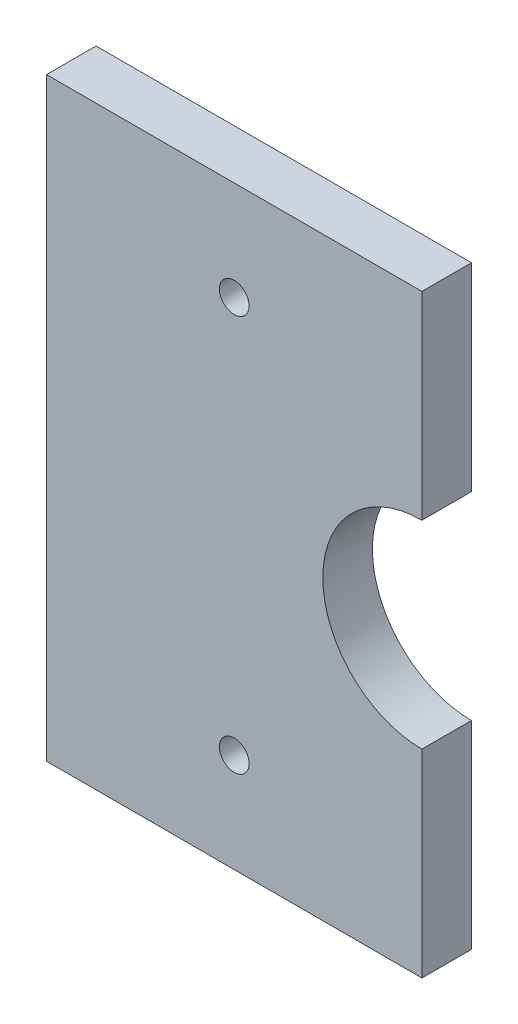
ISO-10303-21;
HEADER;
FILE_DESCRIPTION(('STEP AP214'),'2;1');
FILE_NAME('part.step','',(''),(''),'','','');
FILE_SCHEMA(('AUTOMOTIVE_DESIGN { 1 0 10303 214 1 1 1 1 }'));
ENDSEC;
DATA;
#1=APPLICATION_CONTEXT('core data for automotive mechanical design processes');
#2=APPLICATION_PROTOCOL_DEFINITION('international standard','automotive_design',2000,#1);
#3=PRODUCT_CONTEXT('',#1,'mechanical');
#4=PRODUCT('Part','Part','',(#3));
#5=PRODUCT_RELATED_PRODUCT_CATEGORY('part','',(#4));
#6=PRODUCT_DEFINITION_FORMATION('','',#4);
#7=PRODUCT_DEFINITION_CONTEXT('part definition',#1,'design');
#8=PRODUCT_DEFINITION('design','',#6,#7);
#9=PRODUCT_DEFINITION_SHAPE('','',#8);
#10=(LENGTH_UNIT() NAMED_UNIT(*) SI_UNIT(.MILLI.,.METRE.));
#11=(NAMED_UNIT(*) PLANE_ANGLE_UNIT() SI_UNIT($,.RADIAN.));
#12=(NAMED_UNIT(*) SI_UNIT($,.STERADIAN.) SOLID_ANGLE_UNIT());
#13=UNCERTAINTY_MEASURE_WITH_UNIT(LENGTH_MEASURE(1.E-05),#10,'distance_accuracy_value','');
#14=(GEOMETRIC_REPRESENTATION_CONTEXT(3) GLOBAL_UNCERTAINTY_ASSIGNED_CONTEXT((#13)) GLOBAL_UNIT_ASSIGNED_CONTEXT((#10,
#11,#12)) REPRESENTATION_CONTEXT('',''));
#15=CARTESIAN_POINT('',(0.,0.,0.));
#16=DIRECTION('',(0.,0.,1.));
#17=DIRECTION('',(1.,0.,0.));
#18=AXIS2_PLACEMENT_3D('',#15,#16,#17);
#19=CARTESIAN_POINT('',(0.,0.,10.));
#20=DIRECTION('',(1.,0.,0.));
#21=DIRECTION('',(0.,0.,-1.));
#22=AXIS2_PLACEMENT_3D('',#19,#20,#21);
#23=PLANE('',#22);
#24=DIRECTION('',(0.,0.,1.));
#25=VECTOR('',#24,1.);
#26=CARTESIAN_POINT('',(0.,20.,-10.));
#27=LINE('',#26,#25);
#28=CARTESIAN_POINT('',(0.,20.,0.));
#29=VERTEX_POINT('',#28);
#30=CARTESIAN_POINT('',(0.,20.,10.));
#31=VERTEX_POINT('',#30);
#32=EDGE_CURVE('E100',#29,#31,#27,.T.);
#33=ORIENTED_EDGE('',*,*,#32,.F.);
#34=DIRECTION('',(0.,-1.,0.));
#35=VECTOR('',#34,1.);
#36=CARTESIAN_POINT('',(0.,0.,0.));
#37=LINE('',#36,#35);
#38=CARTESIAN_POINT('',(0.,60.,0.));
#39=VERTEX_POINT('',#38);
#40=EDGE_CURVE('E130',#39,#29,#37,.T.);
#41=ORIENTED_EDGE('',*,*,#40,.F.);
#42=DIRECTION('',(0.,0.,-1.));
#43=VECTOR('',#42,1.);
#44=CARTESIAN_POINT('',(0.,60.,10.));
#45=LINE('',#44,#43);
#46=CARTESIAN_POINT('',(0.,60.,10.));
#47=VERTEX_POINT('',#46);
#48=EDGE_CURVE('E49',#47,#39,#45,.T.);
#49=ORIENTED_EDGE('',*,*,#48,.F.);
#50=DIRECTION('',(0.,-1.,0.));
#51=VECTOR('',#50,1.);
#52=CARTESIAN_POINT('',(0.,0.,10.));
#53=LINE('',#52,#51);
#54=EDGE_CURVE('E110',#47,#31,#53,.T.);
#55=ORIENTED_EDGE('',*,*,#54,.T.);
#56=EDGE_LOOP('',(#33,#41,#49,#55));
#57=FACE_BOUND('',#56,.T.);
#58=ADVANCED_FACE('F41',(#57),#23,.T.);
#59=DIRECTION('',(0.,0.,1.));
#60=VECTOR('',#59,1.);
#61=CARTESIAN_POINT('',(0.,-20.,-10.));
#62=LINE('',#61,#60);
#63=CARTESIAN_POINT('',(0.,-20.,10.));
#64=VERTEX_POINT('',#63);
#65=CARTESIAN_POINT('',(0.,-20.,0.));
#66=VERTEX_POINT('',#65);
#67=EDGE_CURVE('E56',#64,#66,#62,.F.);
#68=ORIENTED_EDGE('',*,*,#67,.F.);
#69=CARTESIAN_POINT('',(0.,-60.,10.));
#70=VERTEX_POINT('',#69);
#71=EDGE_CURVE('E63',#64,#70,#53,.T.);
#72=ORIENTED_EDGE('',*,*,#71,.T.);
#73=DIRECTION('',(0.,0.,-1.));
#74=VECTOR('',#73,1.);
#75=CARTESIAN_POINT('',(0.,-60.,10.));
#76=LINE('',#75,#74);
#77=CARTESIAN_POINT('',(0.,-60.,0.));
#78=VERTEX_POINT('',#77);
#79=EDGE_CURVE('E129',#70,#78,#76,.T.);
#80=ORIENTED_EDGE('',*,*,#79,.T.);
#81=EDGE_CURVE('E85',#66,#78,#37,.T.);
#82=ORIENTED_EDGE('',*,*,#81,.F.);
#83=EDGE_LOOP('',(#68,#72,#80,#82));
#84=FACE_BOUND('',#83,.T.);
#85=ADVANCED_FACE('F43',(#84),#23,.T.);
#86=CARTESIAN_POINT('',(0.,60.,10.));
#87=DIRECTION('',(0.,1.,0.));
#88=DIRECTION('',(0.,0.,1.));
#89=AXIS2_PLACEMENT_3D('',#86,#87,#88);
#90=PLANE('',#89);
#91=DIRECTION('',(1.,0.,0.));
#92=VECTOR('',#91,1.);
#93=CARTESIAN_POINT('',(0.,60.,0.));
#94=LINE('',#93,#92);
#95=CARTESIAN_POINT('',(-75.7608317064828,60.,0.));
#96=VERTEX_POINT('',#95);
#97=EDGE_CURVE('E132',#96,#39,#94,.T.);
#98=ORIENTED_EDGE('',*,*,#97,.F.);
#99=DIRECTION('',(0.,0.,-1.));
#100=VECTOR('',#99,1.);
#101=CARTESIAN_POINT('',(-75.7608317064828,60.,10.));
#102=LINE('',#101,#100);
#103=CARTESIAN_POINT('',(-75.7608317064828,60.,10.));
#104=VERTEX_POINT('',#103);
#105=EDGE_CURVE('E149',#104,#96,#102,.T.);
#106=ORIENTED_EDGE('',*,*,#105,.F.);
#107=DIRECTION('',(1.,0.,0.));
#108=VECTOR('',#107,1.);
#109=CARTESIAN_POINT('',(0.,60.,10.));
#110=LINE('',#109,#108);
#111=EDGE_CURVE('E113',#104,#47,#110,.T.);
#112=ORIENTED_EDGE('',*,*,#111,.T.);
#113=ORIENTED_EDGE('',*,*,#48,.T.);
#114=EDGE_LOOP('',(#98,#106,#112,#113));
#115=FACE_BOUND('',#114,.T.);
#116=ADVANCED_FACE('F152',(#115),#90,.T.);
#117=CARTESIAN_POINT('',(-75.7608317064828,0.,10.));
#118=DIRECTION('',(1.,0.,0.));
#119=DIRECTION('',(0.,0.,-1.));
#120=AXIS2_PLACEMENT_3D('',#117,#118,#119);
#121=PLANE('',#120);
#122=DIRECTION('',(0.,-1.,0.));
#123=VECTOR('',#122,1.);
#124=CARTESIAN_POINT('',(-75.7608317064828,0.,0.));
#125=LINE('',#124,#123);
#126=CARTESIAN_POINT('',(-75.7608317064828,-60.,0.));
#127=VERTEX_POINT('',#126);
#128=EDGE_CURVE('E135',#96,#127,#125,.T.);
#129=ORIENTED_EDGE('',*,*,#128,.T.);
#130=DIRECTION('',(0.,0.,-1.));
#131=VECTOR('',#130,1.);
#132=CARTESIAN_POINT('',(-75.7608317064828,-60.,10.));
#133=LINE('',#132,#131);
#134=CARTESIAN_POINT('',(-75.7608317064828,-60.,10.));
#135=VERTEX_POINT('',#134);
#136=EDGE_CURVE('E146',#135,#127,#133,.T.);
#137=ORIENTED_EDGE('',*,*,#136,.F.);
#138=DIRECTION('',(0.,-1.,0.));
#139=VECTOR('',#138,1.);
#140=CARTESIAN_POINT('',(-75.7608317064828,0.,10.));
#141=LINE('',#140,#139);
#142=EDGE_CURVE('E115',#104,#135,#141,.T.);
#143=ORIENTED_EDGE('',*,*,#142,.F.);
#144=ORIENTED_EDGE('',*,*,#105,.T.);
#145=EDGE_LOOP('',(#129,#137,#143,#144));
#146=FACE_BOUND('',#145,.T.);
#147=ADVANCED_FACE('F158',(#146),#121,.F.);
#148=CARTESIAN_POINT('',(-37.8804158532414,-40.,10.));
#149=DIRECTION('',(0.,0.,-1.));
#150=DIRECTION('',(-1.,0.,0.));
#151=AXIS2_PLACEMENT_3D('',#148,#149,#150);
#152=CYLINDRICAL_SURFACE('',#151,3.);
#153=CARTESIAN_POINT('',(-37.8804158532414,-40.,10.));
#154=DIRECTION('',(0.,0.,1.));
#155=DIRECTION('',(1.,0.,0.));
#156=AXIS2_PLACEMENT_3D('',#153,#154,#155);
#157=CIRCLE('',#156,3.);
#158=CARTESIAN_POINT('',(-34.8804158532414,-40.,10.));
#159=VERTEX_POINT('',#158);
#160=EDGE_CURVE('E123',#159,#159,#157,.T.);
#161=ORIENTED_EDGE('',*,*,#160,.T.);
#162=EDGE_LOOP('',(#161));
#163=FACE_BOUND('',#162,.T.);
#164=CARTESIAN_POINT('',(-37.8804158532414,-40.,0.));
#165=DIRECTION('',(0.,0.,1.));
#166=DIRECTION('',(1.,0.,0.));
#167=AXIS2_PLACEMENT_3D('',#164,#165,#166);
#168=CIRCLE('',#167,3.);
#169=CARTESIAN_POINT('',(-34.8804158532414,-40.,0.));
#170=VERTEX_POINT('',#169);
#171=EDGE_CURVE('E140',#170,#170,#168,.T.);
#172=ORIENTED_EDGE('',*,*,#171,.F.);
#173=EDGE_LOOP('',(#172));
#174=FACE_BOUND('',#173,.T.);
#175=ADVANCED_FACE('F190',(#163,#174),#152,.F.);
#176=CARTESIAN_POINT('',(0.,-60.,10.));
#177=DIRECTION('',(0.,1.,0.));
#178=DIRECTION('',(0.,0.,1.));
#179=AXIS2_PLACEMENT_3D('',#176,#177,#178);
#180=PLANE('',#179);
#181=DIRECTION('',(1.,0.,0.));
#182=VECTOR('',#181,1.);
#183=CARTESIAN_POINT('',(0.,-60.,0.));
#184=LINE('',#183,#182);
#185=EDGE_CURVE('E137',#127,#78,#184,.T.);
#186=ORIENTED_EDGE('',*,*,#185,.T.);
#187=ORIENTED_EDGE('',*,*,#79,.F.);
#188=DIRECTION('',(1.,0.,0.));
#189=VECTOR('',#188,1.);
#190=CARTESIAN_POINT('',(0.,-60.,10.));
#191=LINE('',#190,#189);
#192=EDGE_CURVE('E121',#135,#70,#191,.T.);
#193=ORIENTED_EDGE('',*,*,#192,.F.);
#194=ORIENTED_EDGE('',*,*,#136,.T.);
#195=EDGE_LOOP('',(#186,#187,#193,#194));
#196=FACE_BOUND('',#195,.T.);
#197=ADVANCED_FACE('F162',(#196),#180,.F.);
#198=CARTESIAN_POINT('',(-37.8804158532414,40.,10.));
#199=DIRECTION('',(0.,0.,-1.));
#200=DIRECTION('',(-1.,0.,0.));
#201=AXIS2_PLACEMENT_3D('',#198,#199,#200);
#202=CYLINDRICAL_SURFACE('',#201,3.);
#203=CARTESIAN_POINT('',(-37.8804158532414,40.,10.));
#204=DIRECTION('',(0.,0.,1.));
#205=DIRECTION('',(1.,0.,0.));
#206=AXIS2_PLACEMENT_3D('',#203,#204,#205);
#207=CIRCLE('',#206,3.);
#208=CARTESIAN_POINT('',(-34.8804158532414,40.,10.));
#209=VERTEX_POINT('',#208);
#210=EDGE_CURVE('E126',#209,#209,#207,.T.);
#211=ORIENTED_EDGE('',*,*,#210,.T.);
#212=EDGE_LOOP('',(#211));
#213=FACE_BOUND('',#212,.T.);
#214=CARTESIAN_POINT('',(-37.8804158532414,40.,0.));
#215=DIRECTION('',(0.,0.,1.));
#216=DIRECTION('',(1.,0.,0.));
#217=AXIS2_PLACEMENT_3D('',#214,#215,#216);
#218=CIRCLE('',#217,3.);
#219=CARTESIAN_POINT('',(-34.8804158532414,40.,0.));
#220=VERTEX_POINT('',#219);
#221=EDGE_CURVE('E117',#220,#220,#218,.T.);
#222=ORIENTED_EDGE('',*,*,#221,.F.);
#223=EDGE_LOOP('',(#222));
#224=FACE_BOUND('',#223,.T.);
#225=ADVANCED_FACE('F177',(#213,#224),#202,.F.);
#226=CARTESIAN_POINT('',(0.,0.,10.));
#227=DIRECTION('',(0.,0.,1.));
#228=DIRECTION('',(1.,0.,0.));
#229=AXIS2_PLACEMENT_3D('',#226,#227,#228);
#230=PLANE('',#229);
#231=CARTESIAN_POINT('',(0.,0.,10.));
#232=DIRECTION('',(0.,0.,1.));
#233=DIRECTION('',(1.,0.,0.));
#234=AXIS2_PLACEMENT_3D('',#231,#232,#233);
#235=CIRCLE('',#234,20.);
#236=EDGE_CURVE('E103',#31,#64,#235,.T.);
#237=ORIENTED_EDGE('',*,*,#236,.F.);
#238=ORIENTED_EDGE('',*,*,#54,.F.);
#239=ORIENTED_EDGE('',*,*,#111,.F.);
#240=ORIENTED_EDGE('',*,*,#142,.T.);
#241=ORIENTED_EDGE('',*,*,#192,.T.);
#242=ORIENTED_EDGE('',*,*,#71,.F.);
#243=EDGE_LOOP('',(#237,#238,#239,#240,#241,#242));
#244=FACE_BOUND('',#243,.T.);
#245=ORIENTED_EDGE('',*,*,#160,.F.);
#246=EDGE_LOOP('',(#245));
#247=FACE_BOUND('',#246,.T.);
#248=ORIENTED_EDGE('',*,*,#210,.F.);
#249=EDGE_LOOP('',(#248));
#250=FACE_BOUND('',#249,.T.);
#251=ADVANCED_FACE('F107',(#244,#247,#250),#230,.T.);
#252=CARTESIAN_POINT('',(0.,0.,0.));
#253=DIRECTION('',(0.,0.,1.));
#254=DIRECTION('',(1.,0.,0.));
#255=AXIS2_PLACEMENT_3D('',#252,#253,#254);
#256=PLANE('',#255);
#257=ORIENTED_EDGE('',*,*,#40,.T.);
#258=CARTESIAN_POINT('',(0.,0.,0.));
#259=DIRECTION('',(0.,0.,1.));
#260=DIRECTION('',(1.,0.,0.));
#261=AXIS2_PLACEMENT_3D('',#258,#259,#260);
#262=CIRCLE('',#261,20.);
#263=EDGE_CURVE('E11',#29,#66,#262,.T.);
#264=ORIENTED_EDGE('',*,*,#263,.T.);
#265=ORIENTED_EDGE('',*,*,#81,.T.);
#266=ORIENTED_EDGE('',*,*,#185,.F.);
#267=ORIENTED_EDGE('',*,*,#128,.F.);
#268=ORIENTED_EDGE('',*,*,#97,.T.);
#269=EDGE_LOOP('',(#257,#264,#265,#266,#267,#268));
#270=FACE_BOUND('',#269,.T.);
#271=ORIENTED_EDGE('',*,*,#171,.T.);
#272=EDGE_LOOP('',(#271));
#273=FACE_BOUND('',#272,.T.);
#274=ORIENTED_EDGE('',*,*,#221,.T.);
#275=EDGE_LOOP('',(#274));
#276=FACE_BOUND('',#275,.T.);
#277=ADVANCED_FACE('F154',(#270,#273,#276),#256,.F.);
#278=CARTESIAN_POINT('',(0.,0.,-10.));
#279=DIRECTION('',(0.,0.,1.));
#280=DIRECTION('',(1.,0.,0.));
#281=AXIS2_PLACEMENT_3D('',#278,#279,#280);
#282=CYLINDRICAL_SURFACE('',#281,20.);
#283=ORIENTED_EDGE('',*,*,#32,.T.);
#284=ORIENTED_EDGE('',*,*,#236,.T.);
#285=ORIENTED_EDGE('',*,*,#67,.T.);
#286=ORIENTED_EDGE('',*,*,#263,.F.);
#287=EDGE_LOOP('',(#283,#284,#285,#286));
#288=FACE_BOUND('',#287,.T.);
#289=ADVANCED_FACE('F102',(#288),#282,.F.);
#290=CLOSED_SHELL('',(#58,#85,#116,#147,#175,#197,#225,#251,#277,#289));
#291=MANIFOLD_SOLID_BREP('B2',#290);
#292=ADVANCED_BREP_SHAPE_REPRESENTATION('',(#18,#291),#14);
#293=SHAPE_DEFINITION_REPRESENTATION(#9,#292);
ENDSEC;
END-ISO-10303-21;
